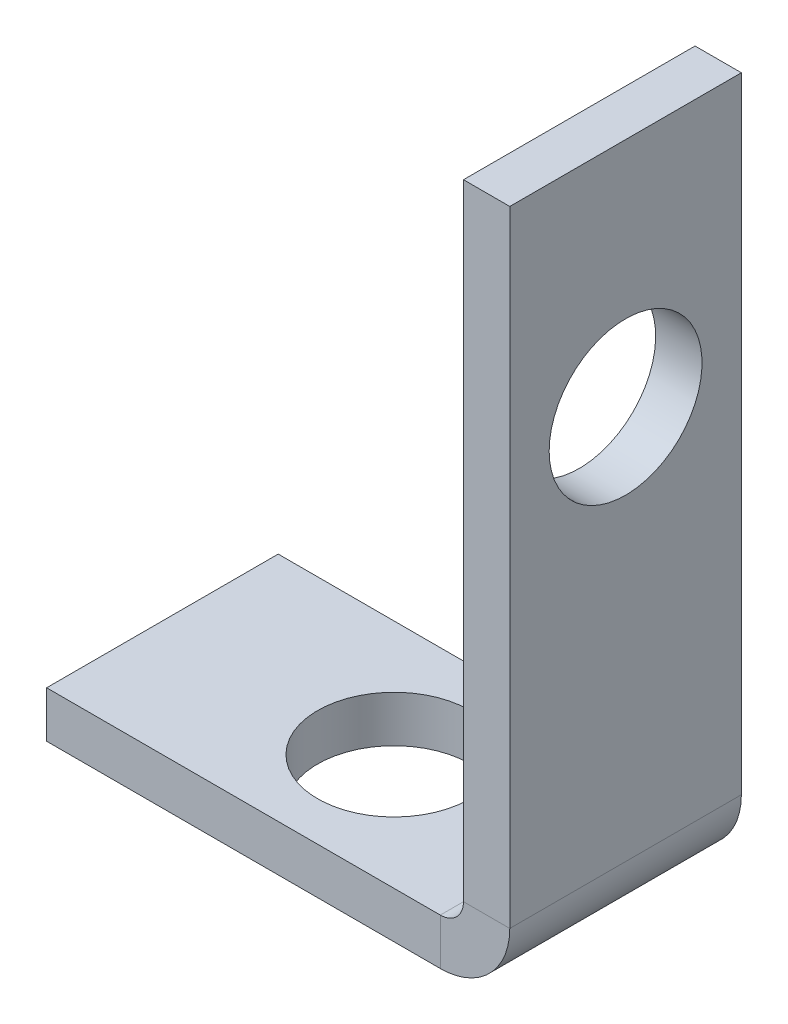
ISO-10303-21;
HEADER;
FILE_DESCRIPTION(('STEP AP214'),'2;1');
FILE_NAME('part.step','',(''),(''),'','','');
FILE_SCHEMA(('AUTOMOTIVE_DESIGN { 1 0 10303 214 1 1 1 1 }'));
ENDSEC;
DATA;
#1=APPLICATION_CONTEXT('core data for automotive mechanical design processes');
#2=APPLICATION_PROTOCOL_DEFINITION('international standard','automotive_design',2000,#1);
#3=PRODUCT_CONTEXT('',#1,'mechanical');
#4=PRODUCT('Part','Part','',(#3));
#5=PRODUCT_RELATED_PRODUCT_CATEGORY('part','',(#4));
#6=PRODUCT_DEFINITION_FORMATION('','',#4);
#7=PRODUCT_DEFINITION_CONTEXT('part definition',#1,'design');
#8=PRODUCT_DEFINITION('design','',#6,#7);
#9=PRODUCT_DEFINITION_SHAPE('','',#8);
#10=(LENGTH_UNIT() NAMED_UNIT(*) SI_UNIT(.MILLI.,.METRE.));
#11=(NAMED_UNIT(*) PLANE_ANGLE_UNIT() SI_UNIT($,.RADIAN.));
#12=(NAMED_UNIT(*) SI_UNIT($,.STERADIAN.) SOLID_ANGLE_UNIT());
#13=UNCERTAINTY_MEASURE_WITH_UNIT(LENGTH_MEASURE(1.E-05),#10,'distance_accuracy_value','');
#14=(GEOMETRIC_REPRESENTATION_CONTEXT(3) GLOBAL_UNCERTAINTY_ASSIGNED_CONTEXT((#13)) GLOBAL_UNIT_ASSIGNED_CONTEXT((#10,
#11,#12)) REPRESENTATION_CONTEXT('',''));
#15=CARTESIAN_POINT('',(0.,0.,0.));
#16=DIRECTION('',(0.,0.,1.));
#17=DIRECTION('',(1.,0.,0.));
#18=AXIS2_PLACEMENT_3D('',#15,#16,#17);
#19=CARTESIAN_POINT('',(-3.,0.,-5.));
#20=DIRECTION('',(0.,0.,-1.));
#21=DIRECTION('',(1.,0.,0.));
#22=AXIS2_PLACEMENT_3D('',#19,#20,#21);
#23=PLANE('',#22);
#24=DIRECTION('',(0.,1.,0.));
#25=VECTOR('',#24,1.);
#26=CARTESIAN_POINT('',(-3.,0.,-5.));
#27=LINE('',#26,#25);
#28=CARTESIAN_POINT('',(-3.,0.,-5.));
#29=VERTEX_POINT('',#28);
#30=CARTESIAN_POINT('',(-3.,2.,-5.));
#31=VERTEX_POINT('',#30);
#32=EDGE_CURVE('E11',#29,#31,#27,.T.);
#33=ORIENTED_EDGE('',*,*,#32,.T.);
#34=CARTESIAN_POINT('',(-3.,3.,-5.));
#35=DIRECTION('',(0.,0.,1.));
#36=DIRECTION('',(1.,0.,0.));
#37=AXIS2_PLACEMENT_3D('',#34,#35,#36);
#38=CIRCLE('',#37,1.);
#39=CARTESIAN_POINT('',(-2.,3.,-5.));
#40=VERTEX_POINT('',#39);
#41=EDGE_CURVE('E119',#40,#31,#38,.F.);
#42=ORIENTED_EDGE('',*,*,#41,.F.);
#43=DIRECTION('',(1.,0.,0.));
#44=VECTOR('',#43,1.);
#45=CARTESIAN_POINT('',(-2.,3.,-5.));
#46=LINE('',#45,#44);
#47=CARTESIAN_POINT('',(0.,3.,-5.));
#48=VERTEX_POINT('',#47);
#49=EDGE_CURVE('E47',#40,#48,#46,.T.);
#50=ORIENTED_EDGE('',*,*,#49,.T.);
#51=CARTESIAN_POINT('',(-3.,3.,-5.));
#52=DIRECTION('',(0.,0.,1.));
#53=DIRECTION('',(1.,0.,0.));
#54=AXIS2_PLACEMENT_3D('',#51,#52,#53);
#55=CIRCLE('',#54,3.);
#56=EDGE_CURVE('E133',#48,#29,#55,.F.);
#57=ORIENTED_EDGE('',*,*,#56,.T.);
#58=EDGE_LOOP('',(#33,#42,#50,#57));
#59=FACE_BOUND('',#58,.T.);
#60=ADVANCED_FACE('F39',(#59),#23,.T.);
#61=CARTESIAN_POINT('',(-2.,3.,-5.));
#62=DIRECTION('',(0.,0.,-1.));
#63=DIRECTION('',(1.,0.,0.));
#64=AXIS2_PLACEMENT_3D('',#61,#62,#63);
#65=PLANE('',#64);
#66=DIRECTION('',(-1.,0.,0.));
#67=VECTOR('',#66,1.);
#68=CARTESIAN_POINT('',(0.,0.,-5.));
#69=LINE('',#68,#67);
#70=CARTESIAN_POINT('',(-20.,0.,-5.));
#71=VERTEX_POINT('',#70);
#72=EDGE_CURVE('E193',#29,#71,#69,.T.);
#73=ORIENTED_EDGE('',*,*,#72,.T.);
#74=DIRECTION('',(0.,1.,0.));
#75=VECTOR('',#74,1.);
#76=CARTESIAN_POINT('',(-20.,0.,-5.));
#77=LINE('',#76,#75);
#78=CARTESIAN_POINT('',(-20.,2.,-5.));
#79=VERTEX_POINT('',#78);
#80=EDGE_CURVE('E195',#71,#79,#77,.T.);
#81=ORIENTED_EDGE('',*,*,#80,.T.);
#82=DIRECTION('',(-1.,0.,0.));
#83=VECTOR('',#82,1.);
#84=CARTESIAN_POINT('',(0.,2.,-5.));
#85=LINE('',#84,#83);
#86=EDGE_CURVE('E158',#31,#79,#85,.T.);
#87=ORIENTED_EDGE('',*,*,#86,.F.);
#88=ORIENTED_EDGE('',*,*,#32,.F.);
#89=EDGE_LOOP('',(#73,#81,#87,#88));
#90=FACE_BOUND('',#89,.T.);
#91=ADVANCED_FACE('F230',(#90),#65,.T.);
#92=CARTESIAN_POINT('',(0.,3.,5.));
#93=DIRECTION('',(0.,0.,1.));
#94=DIRECTION('',(-1.,0.,0.));
#95=AXIS2_PLACEMENT_3D('',#92,#93,#94);
#96=PLANE('',#95);
#97=DIRECTION('',(-1.,0.,0.));
#98=VECTOR('',#97,1.);
#99=CARTESIAN_POINT('',(0.,3.,5.));
#100=LINE('',#99,#98);
#101=CARTESIAN_POINT('',(0.,3.,5.));
#102=VERTEX_POINT('',#101);
#103=CARTESIAN_POINT('',(-2.,3.,5.));
#104=VERTEX_POINT('',#103);
#105=EDGE_CURVE('E173',#102,#104,#100,.T.);
#106=ORIENTED_EDGE('',*,*,#105,.T.);
#107=CARTESIAN_POINT('',(-3.,3.,5.));
#108=DIRECTION('',(0.,0.,1.));
#109=DIRECTION('',(1.,0.,0.));
#110=AXIS2_PLACEMENT_3D('',#107,#108,#109);
#111=CIRCLE('',#110,1.);
#112=CARTESIAN_POINT('',(-3.,2.,5.));
#113=VERTEX_POINT('',#112);
#114=EDGE_CURVE('E155',#104,#113,#111,.F.);
#115=ORIENTED_EDGE('',*,*,#114,.T.);
#116=DIRECTION('',(0.,-1.,0.));
#117=VECTOR('',#116,1.);
#118=CARTESIAN_POINT('',(-3.,2.,5.));
#119=LINE('',#118,#117);
#120=CARTESIAN_POINT('',(-3.,0.,5.));
#121=VERTEX_POINT('',#120);
#122=EDGE_CURVE('E170',#113,#121,#119,.T.);
#123=ORIENTED_EDGE('',*,*,#122,.T.);
#124=CARTESIAN_POINT('',(-3.,3.,5.));
#125=DIRECTION('',(0.,0.,1.));
#126=DIRECTION('',(1.,0.,0.));
#127=AXIS2_PLACEMENT_3D('',#124,#125,#126);
#128=CIRCLE('',#127,3.);
#129=EDGE_CURVE('E146',#102,#121,#128,.F.);
#130=ORIENTED_EDGE('',*,*,#129,.F.);
#131=EDGE_LOOP('',(#106,#115,#123,#130));
#132=FACE_BOUND('',#131,.T.);
#133=ADVANCED_FACE('F183',(#132),#96,.T.);
#134=CARTESIAN_POINT('',(-3.,2.,5.));
#135=DIRECTION('',(0.,0.,1.));
#136=DIRECTION('',(-1.,0.,0.));
#137=AXIS2_PLACEMENT_3D('',#134,#135,#136);
#138=PLANE('',#137);
#139=DIRECTION('',(0.,-1.,0.));
#140=VECTOR('',#139,1.);
#141=CARTESIAN_POINT('',(0.,30.,5.));
#142=LINE('',#141,#140);
#143=CARTESIAN_POINT('',(0.,30.,5.));
#144=VERTEX_POINT('',#143);
#145=EDGE_CURVE('E149',#144,#102,#142,.T.);
#146=ORIENTED_EDGE('',*,*,#145,.F.);
#147=DIRECTION('',(1.,0.,0.));
#148=VECTOR('',#147,1.);
#149=CARTESIAN_POINT('',(-2.,30.,5.));
#150=LINE('',#149,#148);
#151=CARTESIAN_POINT('',(-2.,30.,5.));
#152=VERTEX_POINT('',#151);
#153=EDGE_CURVE('E152',#152,#144,#150,.T.);
#154=ORIENTED_EDGE('',*,*,#153,.F.);
#155=DIRECTION('',(0.,-1.,0.));
#156=VECTOR('',#155,1.);
#157=CARTESIAN_POINT('',(-2.,30.,5.));
#158=LINE('',#157,#156);
#159=EDGE_CURVE('E123',#152,#104,#158,.T.);
#160=ORIENTED_EDGE('',*,*,#159,.T.);
#161=ORIENTED_EDGE('',*,*,#105,.F.);
#162=EDGE_LOOP('',(#146,#154,#160,#161));
#163=FACE_BOUND('',#162,.T.);
#164=ADVANCED_FACE('F186',(#163),#138,.T.);
#165=CARTESIAN_POINT('',(0.,2.,-5.));
#166=DIRECTION('',(0.,-1.,0.));
#167=DIRECTION('',(1.,0.,0.));
#168=AXIS2_PLACEMENT_3D('',#165,#166,#167);
#169=PLANE('',#168);
#170=CARTESIAN_POINT('',(-10.,2.,0.));
#171=DIRECTION('',(0.,-1.,0.));
#172=DIRECTION('',(0.,0.,-1.));
#173=AXIS2_PLACEMENT_3D('',#170,#171,#172);
#174=CIRCLE('',#173,3.29999999999999);
#175=CARTESIAN_POINT('',(-10.,2.,-3.29999999999999));
#176=VERTEX_POINT('',#175);
#177=EDGE_CURVE('E203',#176,#176,#174,.T.);
#178=ORIENTED_EDGE('',*,*,#177,.T.);
#179=EDGE_LOOP('',(#178));
#180=FACE_BOUND('',#179,.T.);
#181=DIRECTION('',(-1.,0.,0.));
#182=VECTOR('',#181,1.);
#183=CARTESIAN_POINT('',(0.,2.,5.));
#184=LINE('',#183,#182);
#185=CARTESIAN_POINT('',(-20.,2.,5.));
#186=VERTEX_POINT('',#185);
#187=EDGE_CURVE('E138',#113,#186,#184,.T.);
#188=ORIENTED_EDGE('',*,*,#187,.F.);
#189=DIRECTION('',(0.,0.,1.));
#190=VECTOR('',#189,1.);
#191=CARTESIAN_POINT('',(-3.,2.,-5.));
#192=LINE('',#191,#190);
#193=EDGE_CURVE('E55',#31,#113,#192,.T.);
#194=ORIENTED_EDGE('',*,*,#193,.F.);
#195=ORIENTED_EDGE('',*,*,#86,.T.);
#196=DIRECTION('',(0.,0.,1.));
#197=VECTOR('',#196,1.);
#198=CARTESIAN_POINT('',(-20.,2.,-5.));
#199=LINE('',#198,#197);
#200=EDGE_CURVE('E96',#79,#186,#199,.T.);
#201=ORIENTED_EDGE('',*,*,#200,.T.);
#202=EDGE_LOOP('',(#188,#194,#195,#201));
#203=FACE_BOUND('',#202,.T.);
#204=ADVANCED_FACE('F242',(#180,#203),#169,.F.);
#205=CARTESIAN_POINT('',(-20.,0.,-5.));
#206=DIRECTION('',(-1.,0.,0.));
#207=DIRECTION('',(0.,0.,-1.));
#208=AXIS2_PLACEMENT_3D('',#205,#206,#207);
#209=PLANE('',#208);
#210=DIRECTION('',(0.,1.,0.));
#211=VECTOR('',#210,1.);
#212=CARTESIAN_POINT('',(-20.,0.,5.));
#213=LINE('',#212,#211);
#214=CARTESIAN_POINT('',(-20.,0.,5.));
#215=VERTEX_POINT('',#214);
#216=EDGE_CURVE('E141',#215,#186,#213,.T.);
#217=ORIENTED_EDGE('',*,*,#216,.T.);
#218=ORIENTED_EDGE('',*,*,#200,.F.);
#219=ORIENTED_EDGE('',*,*,#80,.F.);
#220=DIRECTION('',(0.,0.,1.));
#221=VECTOR('',#220,1.);
#222=CARTESIAN_POINT('',(-20.,0.,-5.));
#223=LINE('',#222,#221);
#224=EDGE_CURVE('E166',#71,#215,#223,.T.);
#225=ORIENTED_EDGE('',*,*,#224,.T.);
#226=EDGE_LOOP('',(#217,#218,#219,#225));
#227=FACE_BOUND('',#226,.T.);
#228=ADVANCED_FACE('F245',(#227),#209,.T.);
#229=CARTESIAN_POINT('',(0.,0.,-5.));
#230=DIRECTION('',(0.,-1.,0.));
#231=DIRECTION('',(1.,0.,0.));
#232=AXIS2_PLACEMENT_3D('',#229,#230,#231);
#233=PLANE('',#232);
#234=CARTESIAN_POINT('',(-10.,0.,0.));
#235=DIRECTION('',(0.,1.,0.));
#236=DIRECTION('',(1.,0.,0.));
#237=AXIS2_PLACEMENT_3D('',#234,#235,#236);
#238=CIRCLE('',#237,3.29999999999999);
#239=CARTESIAN_POINT('',(-6.70000000000001,0.,0.));
#240=VERTEX_POINT('',#239);
#241=EDGE_CURVE('E142',#240,#240,#238,.T.);
#242=ORIENTED_EDGE('',*,*,#241,.T.);
#243=EDGE_LOOP('',(#242));
#244=FACE_BOUND('',#243,.T.);
#245=DIRECTION('',(-1.,0.,0.));
#246=VECTOR('',#245,1.);
#247=CARTESIAN_POINT('',(0.,0.,5.));
#248=LINE('',#247,#246);
#249=EDGE_CURVE('E144',#121,#215,#248,.T.);
#250=ORIENTED_EDGE('',*,*,#249,.T.);
#251=ORIENTED_EDGE('',*,*,#224,.F.);
#252=ORIENTED_EDGE('',*,*,#72,.F.);
#253=DIRECTION('',(0.,0.,1.));
#254=VECTOR('',#253,1.);
#255=CARTESIAN_POINT('',(-3.,0.,-5.));
#256=LINE('',#255,#254);
#257=EDGE_CURVE('E164',#29,#121,#256,.T.);
#258=ORIENTED_EDGE('',*,*,#257,.T.);
#259=EDGE_LOOP('',(#250,#251,#252,#258));
#260=FACE_BOUND('',#259,.T.);
#261=ADVANCED_FACE('F249',(#244,#260),#233,.T.);
#262=CARTESIAN_POINT('',(-3.,3.,-5.));
#263=DIRECTION('',(0.,0.,1.));
#264=DIRECTION('',(-1.,0.,0.));
#265=AXIS2_PLACEMENT_3D('',#262,#263,#264);
#266=CYLINDRICAL_SURFACE('',#265,3.);
#267=ORIENTED_EDGE('',*,*,#129,.T.);
#268=ORIENTED_EDGE('',*,*,#257,.F.);
#269=ORIENTED_EDGE('',*,*,#56,.F.);
#270=DIRECTION('',(0.,0.,1.));
#271=VECTOR('',#270,1.);
#272=CARTESIAN_POINT('',(0.,3.,-5.));
#273=LINE('',#272,#271);
#274=EDGE_CURVE('E162',#48,#102,#273,.T.);
#275=ORIENTED_EDGE('',*,*,#274,.T.);
#276=EDGE_LOOP('',(#267,#268,#269,#275));
#277=FACE_BOUND('',#276,.T.);
#278=ADVANCED_FACE('F191',(#277),#266,.T.);
#279=CARTESIAN_POINT('',(0.,30.,-5.));
#280=DIRECTION('',(1.,0.,0.));
#281=DIRECTION('',(0.,1.,0.));
#282=AXIS2_PLACEMENT_3D('',#279,#280,#281);
#283=PLANE('',#282);
#284=CARTESIAN_POINT('',(0.,20.,0.));
#285=DIRECTION('',(-1.,0.,0.));
#286=DIRECTION('',(0.,0.,1.));
#287=AXIS2_PLACEMENT_3D('',#284,#285,#286);
#288=CIRCLE('',#287,3.29999999999999);
#289=CARTESIAN_POINT('',(0.,20.,3.29999999999999));
#290=VERTEX_POINT('',#289);
#291=EDGE_CURVE('E209',#290,#290,#288,.T.);
#292=ORIENTED_EDGE('',*,*,#291,.T.);
#293=EDGE_LOOP('',(#292));
#294=FACE_BOUND('',#293,.T.);
#295=ORIENTED_EDGE('',*,*,#145,.T.);
#296=ORIENTED_EDGE('',*,*,#274,.F.);
#297=DIRECTION('',(0.,-1.,0.));
#298=VECTOR('',#297,1.);
#299=CARTESIAN_POINT('',(0.,30.,-5.));
#300=LINE('',#299,#298);
#301=CARTESIAN_POINT('',(0.,30.,-5.));
#302=VERTEX_POINT('',#301);
#303=EDGE_CURVE('E131',#302,#48,#300,.T.);
#304=ORIENTED_EDGE('',*,*,#303,.F.);
#305=DIRECTION('',(0.,0.,1.));
#306=VECTOR('',#305,1.);
#307=CARTESIAN_POINT('',(0.,30.,-5.));
#308=LINE('',#307,#306);
#309=EDGE_CURVE('E127',#302,#144,#308,.T.);
#310=ORIENTED_EDGE('',*,*,#309,.T.);
#311=EDGE_LOOP('',(#295,#296,#304,#310));
#312=FACE_BOUND('',#311,.T.);
#313=ADVANCED_FACE('F189',(#294,#312),#283,.T.);
#314=CARTESIAN_POINT('',(-2.,30.,-5.));
#315=DIRECTION('',(0.,1.,0.));
#316=DIRECTION('',(0.,0.,-1.));
#317=AXIS2_PLACEMENT_3D('',#314,#315,#316);
#318=PLANE('',#317);
#319=ORIENTED_EDGE('',*,*,#153,.T.);
#320=ORIENTED_EDGE('',*,*,#309,.F.);
#321=DIRECTION('',(1.,0.,0.));
#322=VECTOR('',#321,1.);
#323=CARTESIAN_POINT('',(-2.,30.,-5.));
#324=LINE('',#323,#322);
#325=CARTESIAN_POINT('',(-2.,30.,-5.));
#326=VERTEX_POINT('',#325);
#327=EDGE_CURVE('E115',#326,#302,#324,.T.);
#328=ORIENTED_EDGE('',*,*,#327,.F.);
#329=DIRECTION('',(0.,0.,1.));
#330=VECTOR('',#329,1.);
#331=CARTESIAN_POINT('',(-2.,30.,-5.));
#332=LINE('',#331,#330);
#333=EDGE_CURVE('E121',#326,#152,#332,.T.);
#334=ORIENTED_EDGE('',*,*,#333,.T.);
#335=EDGE_LOOP('',(#319,#320,#328,#334));
#336=FACE_BOUND('',#335,.T.);
#337=ADVANCED_FACE('F129',(#336),#318,.T.);
#338=CARTESIAN_POINT('',(-2.,30.,-5.));
#339=DIRECTION('',(1.,0.,0.));
#340=DIRECTION('',(0.,1.,0.));
#341=AXIS2_PLACEMENT_3D('',#338,#339,#340);
#342=PLANE('',#341);
#343=CARTESIAN_POINT('',(-2.,20.,0.));
#344=DIRECTION('',(-1.,0.,0.));
#345=DIRECTION('',(0.,1.,0.));
#346=AXIS2_PLACEMENT_3D('',#343,#344,#345);
#347=CIRCLE('',#346,3.29999999999999);
#348=CARTESIAN_POINT('',(-2.,23.3,0.));
#349=VERTEX_POINT('',#348);
#350=EDGE_CURVE('E206',#349,#349,#347,.T.);
#351=ORIENTED_EDGE('',*,*,#350,.F.);
#352=EDGE_LOOP('',(#351));
#353=FACE_BOUND('',#352,.T.);
#354=ORIENTED_EDGE('',*,*,#159,.F.);
#355=ORIENTED_EDGE('',*,*,#333,.F.);
#356=DIRECTION('',(0.,-1.,0.));
#357=VECTOR('',#356,1.);
#358=CARTESIAN_POINT('',(-2.,30.,-5.));
#359=LINE('',#358,#357);
#360=EDGE_CURVE('E111',#326,#40,#359,.T.);
#361=ORIENTED_EDGE('',*,*,#360,.T.);
#362=DIRECTION('',(0.,0.,1.));
#363=VECTOR('',#362,1.);
#364=CARTESIAN_POINT('',(-2.,3.,-5.));
#365=LINE('',#364,#363);
#366=EDGE_CURVE('E84',#40,#104,#365,.T.);
#367=ORIENTED_EDGE('',*,*,#366,.T.);
#368=EDGE_LOOP('',(#354,#355,#361,#367));
#369=FACE_BOUND('',#368,.T.);
#370=ADVANCED_FACE('F122',(#353,#369),#342,.F.);
#371=CARTESIAN_POINT('',(-3.,3.,-5.));
#372=DIRECTION('',(0.,0.,1.));
#373=DIRECTION('',(-1.,0.,0.));
#374=AXIS2_PLACEMENT_3D('',#371,#372,#373);
#375=CYLINDRICAL_SURFACE('',#374,1.);
#376=ORIENTED_EDGE('',*,*,#114,.F.);
#377=ORIENTED_EDGE('',*,*,#366,.F.);
#378=ORIENTED_EDGE('',*,*,#41,.T.);
#379=ORIENTED_EDGE('',*,*,#193,.T.);
#380=EDGE_LOOP('',(#376,#377,#378,#379));
#381=FACE_BOUND('',#380,.T.);
#382=ADVANCED_FACE('F179',(#381),#375,.F.);
#383=CARTESIAN_POINT('',(-3.,3.,-5.));
#384=DIRECTION('',(0.,0.,-1.));
#385=DIRECTION('',(1.,0.,0.));
#386=AXIS2_PLACEMENT_3D('',#383,#384,#385);
#387=PLANE('',#386);
#388=ORIENTED_EDGE('',*,*,#360,.F.);
#389=ORIENTED_EDGE('',*,*,#327,.T.);
#390=ORIENTED_EDGE('',*,*,#303,.T.);
#391=ORIENTED_EDGE('',*,*,#49,.F.);
#392=EDGE_LOOP('',(#388,#389,#390,#391));
#393=FACE_BOUND('',#392,.T.);
#394=ADVANCED_FACE('F113',(#393),#387,.T.);
#395=CARTESIAN_POINT('',(-3.,3.,5.));
#396=DIRECTION('',(0.,0.,-1.));
#397=DIRECTION('',(1.,0.,0.));
#398=AXIS2_PLACEMENT_3D('',#395,#396,#397);
#399=PLANE('',#398);
#400=ORIENTED_EDGE('',*,*,#187,.T.);
#401=ORIENTED_EDGE('',*,*,#216,.F.);
#402=ORIENTED_EDGE('',*,*,#249,.F.);
#403=ORIENTED_EDGE('',*,*,#122,.F.);
#404=EDGE_LOOP('',(#400,#401,#402,#403));
#405=FACE_BOUND('',#404,.T.);
#406=ADVANCED_FACE('F286',(#405),#399,.F.);
#407=CARTESIAN_POINT('',(-10.,2.,0.));
#408=DIRECTION('',(0.,1.,0.));
#409=DIRECTION('',(0.,0.,-1.));
#410=AXIS2_PLACEMENT_3D('',#407,#408,#409);
#411=CYLINDRICAL_SURFACE('',#410,3.29999999999999);
#412=ORIENTED_EDGE('',*,*,#241,.F.);
#413=EDGE_LOOP('',(#412));
#414=FACE_BOUND('',#413,.T.);
#415=ORIENTED_EDGE('',*,*,#177,.F.);
#416=EDGE_LOOP('',(#415));
#417=FACE_BOUND('',#416,.T.);
#418=ADVANCED_FACE('F217',(#414,#417),#411,.F.);
#419=CARTESIAN_POINT('',(0.,20.,0.));
#420=DIRECTION('',(1.,0.,0.));
#421=DIRECTION('',(0.,0.,1.));
#422=AXIS2_PLACEMENT_3D('',#419,#420,#421);
#423=CYLINDRICAL_SURFACE('',#422,3.29999999999999);
#424=ORIENTED_EDGE('',*,*,#291,.F.);
#425=EDGE_LOOP('',(#424));
#426=FACE_BOUND('',#425,.T.);
#427=ORIENTED_EDGE('',*,*,#350,.T.);
#428=EDGE_LOOP('',(#427));
#429=FACE_BOUND('',#428,.T.);
#430=ADVANCED_FACE('F214',(#426,#429),#423,.F.);
#431=CLOSED_SHELL('',(#60,#91,#133,#164,#204,#228,#261,#278,#313,#337,#370,#382,#394,#406,#418,#430));
#432=MANIFOLD_SOLID_BREP('B2',#431);
#433=ADVANCED_BREP_SHAPE_REPRESENTATION('',(#18,#432),#14);
#434=SHAPE_DEFINITION_REPRESENTATION(#9,#433);
ENDSEC;
END-ISO-10303-21;
